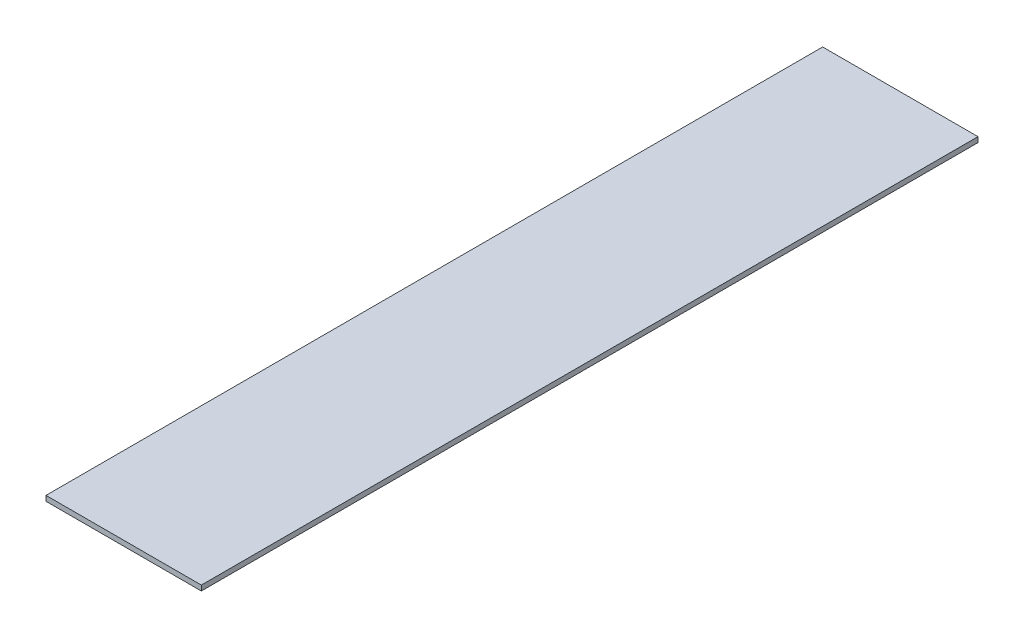
ISO-10303-21;
HEADER;
FILE_DESCRIPTION(('STEP AP214'),'2;1');
FILE_NAME('part.step','',(''),(''),'','','');
FILE_SCHEMA(('AUTOMOTIVE_DESIGN { 1 0 10303 214 1 1 1 1 }'));
ENDSEC;
DATA;
#1=APPLICATION_CONTEXT('core data for automotive mechanical design processes');
#2=APPLICATION_PROTOCOL_DEFINITION('international standard','automotive_design',2000,#1);
#3=PRODUCT_CONTEXT('',#1,'mechanical');
#4=PRODUCT('Part','Part','',(#3));
#5=PRODUCT_RELATED_PRODUCT_CATEGORY('part','',(#4));
#6=PRODUCT_DEFINITION_FORMATION('','',#4);
#7=PRODUCT_DEFINITION_CONTEXT('part definition',#1,'design');
#8=PRODUCT_DEFINITION('design','',#6,#7);
#9=PRODUCT_DEFINITION_SHAPE('','',#8);
#10=(LENGTH_UNIT() NAMED_UNIT(*) SI_UNIT(.MILLI.,.METRE.));
#11=(NAMED_UNIT(*) PLANE_ANGLE_UNIT() SI_UNIT($,.RADIAN.));
#12=(NAMED_UNIT(*) SI_UNIT($,.STERADIAN.) SOLID_ANGLE_UNIT());
#13=UNCERTAINTY_MEASURE_WITH_UNIT(LENGTH_MEASURE(1.E-05),#10,'distance_accuracy_value','');
#14=(GEOMETRIC_REPRESENTATION_CONTEXT(3) GLOBAL_UNCERTAINTY_ASSIGNED_CONTEXT((#13)) GLOBAL_UNIT_ASSIGNED_CONTEXT((#10,
#11,#12)) REPRESENTATION_CONTEXT('',''));
#15=CARTESIAN_POINT('',(0.,0.,0.));
#16=DIRECTION('',(0.,0.,1.));
#17=DIRECTION('',(1.,0.,0.));
#18=AXIS2_PLACEMENT_3D('',#15,#16,#17);
#19=CARTESIAN_POINT('',(0.,1.27,0.));
#20=DIRECTION('',(1.,0.,0.));
#21=DIRECTION('',(0.,0.,-1.));
#22=AXIS2_PLACEMENT_3D('',#19,#20,#21);
#23=PLANE('',#22);
#24=DIRECTION('',(0.,0.,1.));
#25=VECTOR('',#24,1.);
#26=CARTESIAN_POINT('',(0.,0.,0.));
#27=LINE('',#26,#25);
#28=CARTESIAN_POINT('',(0.,0.,0.));
#29=VERTEX_POINT('',#28);
#30=CARTESIAN_POINT('',(0.,0.,190.5));
#31=VERTEX_POINT('',#30);
#32=EDGE_CURVE('E96',#29,#31,#27,.T.);
#33=ORIENTED_EDGE('',*,*,#32,.T.);
#34=DIRECTION('',(0.,-1.,0.));
#35=VECTOR('',#34,1.);
#36=CARTESIAN_POINT('',(0.,1.27,190.5));
#37=LINE('',#36,#35);
#38=CARTESIAN_POINT('',(0.,1.27,190.5));
#39=VERTEX_POINT('',#38);
#40=EDGE_CURVE('E11',#39,#31,#37,.T.);
#41=ORIENTED_EDGE('',*,*,#40,.F.);
#42=DIRECTION('',(0.,0.,1.));
#43=VECTOR('',#42,1.);
#44=CARTESIAN_POINT('',(0.,1.27,0.));
#45=LINE('',#44,#43);
#46=CARTESIAN_POINT('',(0.,1.27,0.));
#47=VERTEX_POINT('',#46);
#48=EDGE_CURVE('E84',#47,#39,#45,.T.);
#49=ORIENTED_EDGE('',*,*,#48,.F.);
#50=DIRECTION('',(0.,-1.,0.));
#51=VECTOR('',#50,1.);
#52=CARTESIAN_POINT('',(0.,1.27,0.));
#53=LINE('',#52,#51);
#54=EDGE_CURVE('E92',#47,#29,#53,.T.);
#55=ORIENTED_EDGE('',*,*,#54,.T.);
#56=EDGE_LOOP('',(#33,#41,#49,#55));
#57=FACE_BOUND('',#56,.T.);
#58=ADVANCED_FACE('F33',(#57),#23,.F.);
#59=CARTESIAN_POINT('',(0.,1.27,190.5));
#60=DIRECTION('',(0.,0.,-1.));
#61=DIRECTION('',(-1.,0.,0.));
#62=AXIS2_PLACEMENT_3D('',#59,#60,#61);
#63=PLANE('',#62);
#64=DIRECTION('',(1.,0.,0.));
#65=VECTOR('',#64,1.);
#66=CARTESIAN_POINT('',(0.,0.,190.5));
#67=LINE('',#66,#65);
#68=CARTESIAN_POINT('',(38.1,0.,190.5));
#69=VERTEX_POINT('',#68);
#70=EDGE_CURVE('E88',#31,#69,#67,.T.);
#71=ORIENTED_EDGE('',*,*,#70,.T.);
#72=DIRECTION('',(0.,-1.,0.));
#73=VECTOR('',#72,1.);
#74=CARTESIAN_POINT('',(38.1,1.27,190.5));
#75=LINE('',#74,#73);
#76=CARTESIAN_POINT('',(38.1,1.27,190.5));
#77=VERTEX_POINT('',#76);
#78=EDGE_CURVE('E41',#77,#69,#75,.T.);
#79=ORIENTED_EDGE('',*,*,#78,.F.);
#80=DIRECTION('',(1.,0.,0.));
#81=VECTOR('',#80,1.);
#82=CARTESIAN_POINT('',(0.,1.27,190.5));
#83=LINE('',#82,#81);
#84=EDGE_CURVE('E79',#39,#77,#83,.T.);
#85=ORIENTED_EDGE('',*,*,#84,.F.);
#86=ORIENTED_EDGE('',*,*,#40,.T.);
#87=EDGE_LOOP('',(#71,#79,#85,#86));
#88=FACE_BOUND('',#87,.T.);
#89=ADVANCED_FACE('F87',(#88),#63,.F.);
#90=CARTESIAN_POINT('',(38.1,1.27,0.));
#91=DIRECTION('',(-1.,0.,0.));
#92=DIRECTION('',(0.,0.,1.));
#93=AXIS2_PLACEMENT_3D('',#90,#91,#92);
#94=PLANE('',#93);
#95=DIRECTION('',(0.,0.,-1.));
#96=VECTOR('',#95,1.);
#97=CARTESIAN_POINT('',(38.1,0.,0.));
#98=LINE('',#97,#96);
#99=CARTESIAN_POINT('',(38.1,0.,0.));
#100=VERTEX_POINT('',#99);
#101=EDGE_CURVE('E66',#69,#100,#98,.T.);
#102=ORIENTED_EDGE('',*,*,#101,.T.);
#103=DIRECTION('',(0.,-1.,0.));
#104=VECTOR('',#103,1.);
#105=CARTESIAN_POINT('',(38.1,1.27,0.));
#106=LINE('',#105,#104);
#107=CARTESIAN_POINT('',(38.1,1.27,0.));
#108=VERTEX_POINT('',#107);
#109=EDGE_CURVE('E89',#108,#100,#106,.T.);
#110=ORIENTED_EDGE('',*,*,#109,.F.);
#111=DIRECTION('',(0.,0.,-1.));
#112=VECTOR('',#111,1.);
#113=CARTESIAN_POINT('',(38.1,1.27,0.));
#114=LINE('',#113,#112);
#115=EDGE_CURVE('E82',#77,#108,#114,.T.);
#116=ORIENTED_EDGE('',*,*,#115,.F.);
#117=ORIENTED_EDGE('',*,*,#78,.T.);
#118=EDGE_LOOP('',(#102,#110,#116,#117));
#119=FACE_BOUND('',#118,.T.);
#120=ADVANCED_FACE('F90',(#119),#94,.F.);
#121=CARTESIAN_POINT('',(0.,1.27,0.));
#122=DIRECTION('',(0.,0.,1.));
#123=DIRECTION('',(1.,0.,0.));
#124=AXIS2_PLACEMENT_3D('',#121,#122,#123);
#125=PLANE('',#124);
#126=DIRECTION('',(-1.,0.,0.));
#127=VECTOR('',#126,1.);
#128=CARTESIAN_POINT('',(0.,0.,0.));
#129=LINE('',#128,#127);
#130=EDGE_CURVE('E72',#100,#29,#129,.T.);
#131=ORIENTED_EDGE('',*,*,#130,.T.);
#132=ORIENTED_EDGE('',*,*,#54,.F.);
#133=DIRECTION('',(-1.,0.,0.));
#134=VECTOR('',#133,1.);
#135=CARTESIAN_POINT('',(0.,1.27,0.));
#136=LINE('',#135,#134);
#137=EDGE_CURVE('E49',#108,#47,#136,.T.);
#138=ORIENTED_EDGE('',*,*,#137,.F.);
#139=ORIENTED_EDGE('',*,*,#109,.T.);
#140=EDGE_LOOP('',(#131,#132,#138,#139));
#141=FACE_BOUND('',#140,.T.);
#142=ADVANCED_FACE('F103',(#141),#125,.F.);
#143=CARTESIAN_POINT('',(0.,1.27,0.));
#144=DIRECTION('',(0.,1.,0.));
#145=DIRECTION('',(0.,0.,1.));
#146=AXIS2_PLACEMENT_3D('',#143,#144,#145);
#147=PLANE('',#146);
#148=ORIENTED_EDGE('',*,*,#48,.T.);
#149=ORIENTED_EDGE('',*,*,#84,.T.);
#150=ORIENTED_EDGE('',*,*,#115,.T.);
#151=ORIENTED_EDGE('',*,*,#137,.T.);
#152=EDGE_LOOP('',(#148,#149,#150,#151));
#153=FACE_BOUND('',#152,.T.);
#154=ADVANCED_FACE('F80',(#153),#147,.T.);
#155=CARTESIAN_POINT('',(0.,0.,0.));
#156=DIRECTION('',(0.,1.,0.));
#157=DIRECTION('',(0.,0.,1.));
#158=AXIS2_PLACEMENT_3D('',#155,#156,#157);
#159=PLANE('',#158);
#160=ORIENTED_EDGE('',*,*,#32,.F.);
#161=ORIENTED_EDGE('',*,*,#130,.F.);
#162=ORIENTED_EDGE('',*,*,#101,.F.);
#163=ORIENTED_EDGE('',*,*,#70,.F.);
#164=EDGE_LOOP('',(#160,#161,#162,#163));
#165=FACE_BOUND('',#164,.T.);
#166=ADVANCED_FACE('F106',(#165),#159,.F.);
#167=CLOSED_SHELL('',(#58,#89,#120,#142,#154,#166));
#168=MANIFOLD_SOLID_BREP('B2',#167);
#169=ADVANCED_BREP_SHAPE_REPRESENTATION('',(#18,#168),#14);
#170=SHAPE_DEFINITION_REPRESENTATION(#9,#169);
ENDSEC;
END-ISO-10303-21;
